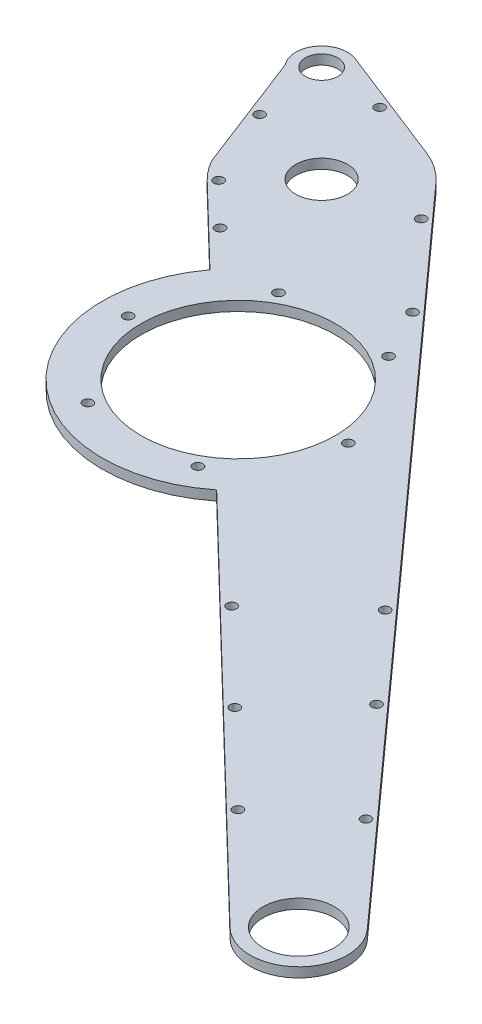
ISO-10303-21;
HEADER;
FILE_DESCRIPTION(('STEP AP214'),'2;1');
FILE_NAME('part.step','',(''),(''),'','','');
FILE_SCHEMA(('AUTOMOTIVE_DESIGN { 1 0 10303 214 1 1 1 1 }'));
ENDSEC;
DATA;
#1=APPLICATION_CONTEXT('core data for automotive mechanical design processes');
#2=APPLICATION_PROTOCOL_DEFINITION('international standard','automotive_design',2000,#1);
#3=PRODUCT_CONTEXT('',#1,'mechanical');
#4=PRODUCT('Part','Part','',(#3));
#5=PRODUCT_RELATED_PRODUCT_CATEGORY('part','',(#4));
#6=PRODUCT_DEFINITION_FORMATION('','',#4);
#7=PRODUCT_DEFINITION_CONTEXT('part definition',#1,'design');
#8=PRODUCT_DEFINITION('design','',#6,#7);
#9=PRODUCT_DEFINITION_SHAPE('','',#8);
#10=(LENGTH_UNIT() NAMED_UNIT(*) SI_UNIT(.MILLI.,.METRE.));
#11=(NAMED_UNIT(*) PLANE_ANGLE_UNIT() SI_UNIT($,.RADIAN.));
#12=(NAMED_UNIT(*) SI_UNIT($,.STERADIAN.) SOLID_ANGLE_UNIT());
#13=UNCERTAINTY_MEASURE_WITH_UNIT(LENGTH_MEASURE(1.E-05),#10,'distance_accuracy_value','');
#14=(GEOMETRIC_REPRESENTATION_CONTEXT(3) GLOBAL_UNCERTAINTY_ASSIGNED_CONTEXT((#13)) GLOBAL_UNIT_ASSIGNED_CONTEXT((#10,
#11,#12)) REPRESENTATION_CONTEXT('',''));
#15=CARTESIAN_POINT('',(0.,0.,0.));
#16=DIRECTION('',(0.,0.,1.));
#17=DIRECTION('',(1.,0.,0.));
#18=AXIS2_PLACEMENT_3D('',#15,#16,#17);
#19=CARTESIAN_POINT('',(40.6989429108541,3.,66.4645055499677));
#20=DIRECTION('',(0.,-1.,0.));
#21=DIRECTION('',(0.,0.,-1.));
#22=AXIS2_PLACEMENT_3D('',#19,#20,#21);
#23=CYLINDRICAL_SURFACE('',#22,42.);
#24=CARTESIAN_POINT('',(40.6989429108541,0.,66.4645055499677));
#25=DIRECTION('',(0.,1.,0.));
#26=DIRECTION('',(0.,0.,1.));
#27=AXIS2_PLACEMENT_3D('',#24,#25,#26);
#28=CIRCLE('',#27,42.);
#29=CARTESIAN_POINT('',(6.95401125447118,0.,41.4589144250603));
#30=VERTEX_POINT('',#29);
#31=CARTESIAN_POINT('',(66.8817826108157,0.,99.3044036199391));
#32=VERTEX_POINT('',#31);
#33=EDGE_CURVE('E260',#30,#32,#28,.T.);
#34=ORIENTED_EDGE('',*,*,#33,.T.);
#35=DIRECTION('',(0.,-1.,0.));
#36=VECTOR('',#35,1.);
#37=CARTESIAN_POINT('',(66.8817826108157,3.,99.3044036199391));
#38=LINE('',#37,#36);
#39=CARTESIAN_POINT('',(66.8817826108157,3.,99.3044036199391));
#40=VERTEX_POINT('',#39);
#41=EDGE_CURVE('E11',#40,#32,#38,.T.);
#42=ORIENTED_EDGE('',*,*,#41,.F.);
#43=CARTESIAN_POINT('',(40.6989429108541,3.,66.4645055499677));
#44=DIRECTION('',(0.,1.,0.));
#45=DIRECTION('',(0.,0.,1.));
#46=AXIS2_PLACEMENT_3D('',#43,#44,#45);
#47=CIRCLE('',#46,42.);
#48=CARTESIAN_POINT('',(6.95401125447118,3.,41.4589144250603));
#49=VERTEX_POINT('',#48);
#50=EDGE_CURVE('E162',#49,#40,#47,.T.);
#51=ORIENTED_EDGE('',*,*,#50,.F.);
#52=DIRECTION('',(0.,-1.,0.));
#53=VECTOR('',#52,1.);
#54=CARTESIAN_POINT('',(6.95401125447118,3.,41.4589144250603));
#55=LINE('',#54,#53);
#56=EDGE_CURVE('E319',#49,#30,#55,.T.);
#57=ORIENTED_EDGE('',*,*,#56,.T.);
#58=EDGE_LOOP('',(#34,#42,#51,#57));
#59=FACE_BOUND('',#58,.T.);
#60=ADVANCED_FACE('F37',(#59),#23,.T.);
#61=CARTESIAN_POINT('',(-17.3624071779741,3.,17.9874071779741));
#62=DIRECTION('',(0.694496287118964,0.,-0.719496287118964));
#63=DIRECTION('',(-0.719496287118964,0.,-0.694496287118964));
#64=AXIS2_PLACEMENT_3D('',#61,#62,#63);
#65=PLANE('',#64);
#66=DIRECTION('',(0.719496287118964,0.,0.694496287118963));
#67=VECTOR('',#66,1.);
#68=CARTESIAN_POINT('',(-17.3624071779741,0.,17.9874071779741));
#69=LINE('',#68,#67);
#70=CARTESIAN_POINT('',(186.110074257621,0.,214.389925742379));
#71=VERTEX_POINT('',#70);
#72=EDGE_CURVE('E264',#32,#71,#69,.T.);
#73=ORIENTED_EDGE('',*,*,#72,.T.);
#74=DIRECTION('',(0.,-1.,0.));
#75=VECTOR('',#74,1.);
#76=CARTESIAN_POINT('',(186.110074257621,3.,214.389925742379));
#77=LINE('',#76,#75);
#78=CARTESIAN_POINT('',(186.110074257621,3.,214.389925742379));
#79=VERTEX_POINT('',#78);
#80=EDGE_CURVE('E46',#79,#71,#77,.T.);
#81=ORIENTED_EDGE('',*,*,#80,.F.);
#82=DIRECTION('',(0.719496287118964,0.,0.694496287118963));
#83=VECTOR('',#82,1.);
#84=CARTESIAN_POINT('',(-17.3624071779741,3.,17.9874071779741));
#85=LINE('',#84,#83);
#86=EDGE_CURVE('E104',#40,#79,#85,.T.);
#87=ORIENTED_EDGE('',*,*,#86,.F.);
#88=ORIENTED_EDGE('',*,*,#41,.T.);
#89=EDGE_LOOP('',(#73,#81,#87,#88));
#90=FACE_BOUND('',#89,.T.);
#91=ADVANCED_FACE('F344',(#90),#65,.F.);
#92=CARTESIAN_POINT('',(196.527518564405,3.,203.597481435595));
#93=DIRECTION('',(0.,-1.,0.));
#94=DIRECTION('',(0.,0.,-1.));
#95=AXIS2_PLACEMENT_3D('',#92,#93,#94);
#96=CYLINDRICAL_SURFACE('',#95,15.);
#97=CARTESIAN_POINT('',(196.527518564405,0.,203.597481435595));
#98=DIRECTION('',(0.,1.,0.));
#99=DIRECTION('',(0.,0.,1.));
#100=AXIS2_PLACEMENT_3D('',#97,#98,#99);
#101=CIRCLE('',#100,15.);
#102=CARTESIAN_POINT('',(207.681250795877,0.,193.567812582206));
#103=VERTEX_POINT('',#102);
#104=EDGE_CURVE('E269',#71,#103,#101,.T.);
#105=ORIENTED_EDGE('',*,*,#104,.T.);
#106=DIRECTION('',(0.,-1.,0.));
#107=VECTOR('',#106,1.);
#108=CARTESIAN_POINT('',(207.681250795877,3.,193.567812582206));
#109=LINE('',#108,#107);
#110=CARTESIAN_POINT('',(207.681250795877,3.,193.567812582206));
#111=VERTEX_POINT('',#110);
#112=EDGE_CURVE('E329',#111,#103,#109,.T.);
#113=ORIENTED_EDGE('',*,*,#112,.F.);
#114=CARTESIAN_POINT('',(196.527518564405,3.,203.597481435595));
#115=DIRECTION('',(0.,1.,0.));
#116=DIRECTION('',(0.,0.,1.));
#117=AXIS2_PLACEMENT_3D('',#114,#115,#116);
#118=CIRCLE('',#117,15.);
#119=EDGE_CURVE('E157',#79,#111,#118,.T.);
#120=ORIENTED_EDGE('',*,*,#119,.F.);
#121=ORIENTED_EDGE('',*,*,#80,.T.);
#122=EDGE_LOOP('',(#105,#113,#120,#121));
#123=FACE_BOUND('',#122,.T.);
#124=ADVANCED_FACE('F334',(#123),#96,.T.);
#125=CARTESIAN_POINT('',(18.5895537191193,3.,-16.7161147556476));
#126=DIRECTION('',(0.743582148764772,0.,-0.668644590225902));
#127=DIRECTION('',(-0.668644590225902,0.,-0.743582148764772));
#128=AXIS2_PLACEMENT_3D('',#125,#126,#127);
#129=PLANE('',#128);
#130=DIRECTION('',(0.668644590225902,0.,0.743582148764772));
#131=VECTOR('',#130,1.);
#132=CARTESIAN_POINT('',(18.5895537191193,0.,-16.7161147556476));
#133=LINE('',#132,#131);
#134=CARTESIAN_POINT('',(18.5895537191193,0.,-16.7161147556476));
#135=VERTEX_POINT('',#134);
#136=EDGE_CURVE('E277',#135,#103,#133,.T.);
#137=ORIENTED_EDGE('',*,*,#136,.F.);
#138=DIRECTION('',(0.,-1.,0.));
#139=VECTOR('',#138,1.);
#140=CARTESIAN_POINT('',(18.5895537191193,3.,-16.7161147556476));
#141=LINE('',#140,#139);
#142=CARTESIAN_POINT('',(18.5895537191193,3.,-16.7161147556476));
#143=VERTEX_POINT('',#142);
#144=EDGE_CURVE('E327',#143,#135,#141,.T.);
#145=ORIENTED_EDGE('',*,*,#144,.F.);
#146=DIRECTION('',(0.668644590225902,0.,0.743582148764772));
#147=VECTOR('',#146,1.);
#148=CARTESIAN_POINT('',(18.5895537191193,3.,-16.7161147556476));
#149=LINE('',#148,#147);
#150=EDGE_CURVE('E151',#143,#111,#149,.T.);
#151=ORIENTED_EDGE('',*,*,#150,.T.);
#152=ORIENTED_EDGE('',*,*,#112,.T.);
#153=EDGE_LOOP('',(#137,#145,#151,#152));
#154=FACE_BOUND('',#153,.T.);
#155=ADVANCED_FACE('F340',(#154),#129,.T.);
#156=CARTESIAN_POINT('',(0.,3.,0.));
#157=DIRECTION('',(0.,-1.,0.));
#158=DIRECTION('',(0.,0.,-1.));
#159=AXIS2_PLACEMENT_3D('',#156,#157,#158);
#160=CYLINDRICAL_SURFACE('',#159,25.);
#161=CARTESIAN_POINT('',(0.,0.,0.));
#162=DIRECTION('',(0.,1.,0.));
#163=DIRECTION('',(0.,0.,1.));
#164=AXIS2_PLACEMENT_3D('',#161,#162,#163);
#165=CIRCLE('',#164,25.);
#166=CARTESIAN_POINT('',(9.113159771314,0.,-23.2798264379807));
#167=VERTEX_POINT('',#166);
#168=EDGE_CURVE('E280',#135,#167,#165,.T.);
#169=ORIENTED_EDGE('',*,*,#168,.T.);
#170=DIRECTION('',(0.,-1.,0.));
#171=VECTOR('',#170,1.);
#172=CARTESIAN_POINT('',(9.113159771314,3.,-23.2798264379807));
#173=LINE('',#172,#171);
#174=CARTESIAN_POINT('',(9.113159771314,3.,-23.2798264379807));
#175=VERTEX_POINT('',#174);
#176=EDGE_CURVE('E325',#175,#167,#173,.T.);
#177=ORIENTED_EDGE('',*,*,#176,.F.);
#178=CARTESIAN_POINT('',(0.,3.,0.));
#179=DIRECTION('',(0.,1.,0.));
#180=DIRECTION('',(0.,0.,1.));
#181=AXIS2_PLACEMENT_3D('',#178,#179,#180);
#182=CIRCLE('',#181,25.);
#183=EDGE_CURVE('E145',#143,#175,#182,.T.);
#184=ORIENTED_EDGE('',*,*,#183,.F.);
#185=ORIENTED_EDGE('',*,*,#144,.T.);
#186=EDGE_LOOP('',(#169,#177,#184,#185));
#187=FACE_BOUND('',#186,.T.);
#188=ADVANCED_FACE('F342',(#187),#160,.T.);
#189=CARTESIAN_POINT('',(9.11315977131401,3.,-23.2798264379807));
#190=DIRECTION('',(0.36452639085256,0.,-0.931193057519227));
#191=DIRECTION('',(-0.931193057519227,0.,-0.36452639085256));
#192=AXIS2_PLACEMENT_3D('',#189,#190,#191);
#193=PLANE('',#192);
#194=DIRECTION('',(0.931193057519227,0.,0.36452639085256));
#195=VECTOR('',#194,1.);
#196=CARTESIAN_POINT('',(9.11315977131401,0.,-23.2798264379807));
#197=LINE('',#196,#195);
#198=CARTESIAN_POINT('',(-27.0837888731795,0.,-37.4495444601538));
#199=VERTEX_POINT('',#198);
#200=EDGE_CURVE('E283',#199,#167,#197,.T.);
#201=ORIENTED_EDGE('',*,*,#200,.F.);
#202=DIRECTION('',(0.,-1.,0.));
#203=VECTOR('',#202,1.);
#204=CARTESIAN_POINT('',(-27.0837888731795,3.,-37.4495444601538));
#205=LINE('',#204,#203);
#206=CARTESIAN_POINT('',(-27.0837888731795,3.,-37.4495444601538));
#207=VERTEX_POINT('',#206);
#208=EDGE_CURVE('E323',#207,#199,#205,.T.);
#209=ORIENTED_EDGE('',*,*,#208,.F.);
#210=DIRECTION('',(0.931193057519227,0.,0.36452639085256));
#211=VECTOR('',#210,1.);
#212=CARTESIAN_POINT('',(9.11315977131401,3.,-23.2798264379807));
#213=LINE('',#212,#211);
#214=EDGE_CURVE('E150',#207,#175,#213,.T.);
#215=ORIENTED_EDGE('',*,*,#214,.T.);
#216=ORIENTED_EDGE('',*,*,#176,.T.);
#217=EDGE_LOOP('',(#201,#209,#215,#216));
#218=FACE_BOUND('',#217,.T.);
#219=ADVANCED_FACE('F354',(#218),#193,.T.);
#220=CARTESIAN_POINT('',(-30.,3.,-30.));
#221=DIRECTION('',(0.,-1.,0.));
#222=DIRECTION('',(0.,0.,-1.));
#223=AXIS2_PLACEMENT_3D('',#220,#221,#222);
#224=CYLINDRICAL_SURFACE('',#223,7.99999999999999);
#225=CARTESIAN_POINT('',(-30.,0.,-30.));
#226=DIRECTION('',(0.,1.,0.));
#227=DIRECTION('',(0.,0.,1.));
#228=AXIS2_PLACEMENT_3D('',#225,#226,#227);
#229=CIRCLE('',#228,7.99999999999999);
#230=CARTESIAN_POINT('',(-36.2449979983984,0.,-25.));
#231=VERTEX_POINT('',#230);
#232=EDGE_CURVE('E286',#199,#231,#229,.T.);
#233=ORIENTED_EDGE('',*,*,#232,.T.);
#234=DIRECTION('',(0.,-1.,0.));
#235=VECTOR('',#234,1.);
#236=CARTESIAN_POINT('',(-36.2449979983984,3.,-25.));
#237=LINE('',#236,#235);
#238=CARTESIAN_POINT('',(-36.2449979983984,3.,-25.));
#239=VERTEX_POINT('',#238);
#240=EDGE_CURVE('E140',#239,#231,#237,.T.);
#241=ORIENTED_EDGE('',*,*,#240,.F.);
#242=CARTESIAN_POINT('',(-30.,3.,-30.));
#243=DIRECTION('',(0.,1.,0.));
#244=DIRECTION('',(0.,0.,1.));
#245=AXIS2_PLACEMENT_3D('',#242,#243,#244);
#246=CIRCLE('',#245,7.99999999999999);
#247=EDGE_CURVE('E131',#207,#239,#246,.T.);
#248=ORIENTED_EDGE('',*,*,#247,.F.);
#249=ORIENTED_EDGE('',*,*,#208,.T.);
#250=EDGE_LOOP('',(#233,#241,#248,#249));
#251=FACE_BOUND('',#250,.T.);
#252=ADVANCED_FACE('F357',(#251),#224,.T.);
#253=CARTESIAN_POINT('',(-23.1346555993659,3.,8.93719329089938));
#254=DIRECTION('',(0.932814350448732,0.,-0.360357305457945));
#255=DIRECTION('',(-0.360357305457945,0.,-0.932814350448732));
#256=AXIS2_PLACEMENT_3D('',#253,#254,#255);
#257=PLANE('',#256);
#258=DIRECTION('',(0.360357305457945,0.,0.932814350448732));
#259=VECTOR('',#258,1.);
#260=CARTESIAN_POINT('',(-23.1346555993659,0.,8.93719329089938));
#261=LINE('',#260,#259);
#262=CARTESIAN_POINT('',(-22.,0.,11.8743420870379));
#263=VERTEX_POINT('',#262);
#264=EDGE_CURVE('E139',#231,#263,#261,.T.);
#265=ORIENTED_EDGE('',*,*,#264,.T.);
#266=DIRECTION('',(0.,-1.,0.));
#267=VECTOR('',#266,1.);
#268=CARTESIAN_POINT('',(-22.,3.,11.8743420870379));
#269=LINE('',#268,#267);
#270=CARTESIAN_POINT('',(-22.,3.,11.8743420870379));
#271=VERTEX_POINT('',#270);
#272=EDGE_CURVE('E136',#271,#263,#269,.T.);
#273=ORIENTED_EDGE('',*,*,#272,.F.);
#274=DIRECTION('',(0.360357305457945,0.,0.932814350448732));
#275=VECTOR('',#274,1.);
#276=CARTESIAN_POINT('',(-23.1346555993659,3.,8.93719329089938));
#277=LINE('',#276,#275);
#278=EDGE_CURVE('E123',#239,#271,#277,.T.);
#279=ORIENTED_EDGE('',*,*,#278,.F.);
#280=ORIENTED_EDGE('',*,*,#240,.T.);
#281=EDGE_LOOP('',(#265,#273,#279,#280));
#282=FACE_BOUND('',#281,.T.);
#283=ADVANCED_FACE('F137',(#282),#257,.F.);
#284=CARTESIAN_POINT('',(-17.3624071779741,0.,17.9874071779741));
#285=VERTEX_POINT('',#284);
#286=EDGE_CURVE('E90',#263,#285,#165,.T.);
#287=ORIENTED_EDGE('',*,*,#286,.T.);
#288=DIRECTION('',(0.,-1.,0.));
#289=VECTOR('',#288,1.);
#290=CARTESIAN_POINT('',(-17.3624071779741,3.,17.9874071779741));
#291=LINE('',#290,#289);
#292=CARTESIAN_POINT('',(-17.3624071779741,3.,17.9874071779741));
#293=VERTEX_POINT('',#292);
#294=EDGE_CURVE('E141',#293,#285,#291,.T.);
#295=ORIENTED_EDGE('',*,*,#294,.F.);
#296=EDGE_CURVE('E128',#271,#293,#182,.T.);
#297=ORIENTED_EDGE('',*,*,#296,.F.);
#298=ORIENTED_EDGE('',*,*,#272,.T.);
#299=EDGE_LOOP('',(#287,#295,#297,#298));
#300=FACE_BOUND('',#299,.T.);
#301=ADVANCED_FACE('F143',(#300),#160,.T.);
#302=CARTESIAN_POINT('',(-30.,3.,-30.));
#303=DIRECTION('',(0.,-1.,0.));
#304=DIRECTION('',(0.,0.,-1.));
#305=AXIS2_PLACEMENT_3D('',#302,#303,#304);
#306=CYLINDRICAL_SURFACE('',#305,5.);
#307=CARTESIAN_POINT('',(-30.,3.,-30.));
#308=DIRECTION('',(0.,1.,0.));
#309=DIRECTION('',(0.,0.,1.));
#310=AXIS2_PLACEMENT_3D('',#307,#308,#309);
#311=CIRCLE('',#310,5.);
#312=CARTESIAN_POINT('',(-30.,3.,-25.));
#313=VERTEX_POINT('',#312);
#314=EDGE_CURVE('E744',#313,#313,#311,.T.);
#315=ORIENTED_EDGE('',*,*,#314,.T.);
#316=EDGE_LOOP('',(#315));
#317=FACE_BOUND('',#316,.T.);
#318=CARTESIAN_POINT('',(-30.,0.,-30.));
#319=DIRECTION('',(0.,1.,0.));
#320=DIRECTION('',(0.,0.,1.));
#321=AXIS2_PLACEMENT_3D('',#318,#319,#320);
#322=CIRCLE('',#321,5.);
#323=CARTESIAN_POINT('',(-30.,0.,-25.));
#324=VERTEX_POINT('',#323);
#325=EDGE_CURVE('E314',#324,#324,#322,.T.);
#326=ORIENTED_EDGE('',*,*,#325,.F.);
#327=EDGE_LOOP('',(#326));
#328=FACE_BOUND('',#327,.T.);
#329=ADVANCED_FACE('F366',(#317,#328),#306,.F.);
#330=CARTESIAN_POINT('',(23.6989429108537,3.,95.9093692786384));
#331=DIRECTION('',(0.,-1.,0.));
#332=DIRECTION('',(0.,0.,-1.));
#333=AXIS2_PLACEMENT_3D('',#330,#331,#332);
#334=CYLINDRICAL_SURFACE('',#333,1.5);
#335=CARTESIAN_POINT('',(23.6989429108537,3.,95.9093692786384));
#336=DIRECTION('',(0.,1.,0.));
#337=DIRECTION('',(0.,0.,1.));
#338=AXIS2_PLACEMENT_3D('',#335,#336,#337);
#339=CIRCLE('',#338,1.5);
#340=CARTESIAN_POINT('',(23.6989429108537,3.,97.4093692786384));
#341=VERTEX_POINT('',#340);
#342=EDGE_CURVE('E746',#341,#341,#339,.T.);
#343=ORIENTED_EDGE('',*,*,#342,.T.);
#344=EDGE_LOOP('',(#343));
#345=FACE_BOUND('',#344,.T.);
#346=CARTESIAN_POINT('',(23.6989429108537,0.,95.9093692786384));
#347=DIRECTION('',(0.,1.,0.));
#348=DIRECTION('',(0.,0.,1.));
#349=AXIS2_PLACEMENT_3D('',#346,#347,#348);
#350=CIRCLE('',#349,1.5);
#351=CARTESIAN_POINT('',(23.6989429108537,0.,97.4093692786384));
#352=VERTEX_POINT('',#351);
#353=EDGE_CURVE('E311',#352,#352,#350,.T.);
#354=ORIENTED_EDGE('',*,*,#353,.F.);
#355=EDGE_LOOP('',(#354));
#356=FACE_BOUND('',#355,.T.);
#357=ADVANCED_FACE('F397',(#345,#356),#334,.F.);
#358=CARTESIAN_POINT('',(57.6989429108538,3.,95.9093692786387));
#359=DIRECTION('',(0.,-1.,0.));
#360=DIRECTION('',(0.,0.,-1.));
#361=AXIS2_PLACEMENT_3D('',#358,#359,#360);
#362=CYLINDRICAL_SURFACE('',#361,1.5);
#363=CARTESIAN_POINT('',(57.6989429108538,3.,95.9093692786387));
#364=DIRECTION('',(0.,1.,0.));
#365=DIRECTION('',(0.,0.,1.));
#366=AXIS2_PLACEMENT_3D('',#363,#364,#365);
#367=CIRCLE('',#366,1.5);
#368=CARTESIAN_POINT('',(57.6989429108538,3.,97.4093692786387));
#369=VERTEX_POINT('',#368);
#370=EDGE_CURVE('E749',#369,#369,#367,.T.);
#371=ORIENTED_EDGE('',*,*,#370,.T.);
#372=EDGE_LOOP('',(#371));
#373=FACE_BOUND('',#372,.T.);
#374=CARTESIAN_POINT('',(57.6989429108538,0.,95.9093692786387));
#375=DIRECTION('',(0.,1.,0.));
#376=DIRECTION('',(0.,0.,1.));
#377=AXIS2_PLACEMENT_3D('',#374,#375,#376);
#378=CIRCLE('',#377,1.5);
#379=CARTESIAN_POINT('',(57.6989429108538,0.,97.4093692786387));
#380=VERTEX_POINT('',#379);
#381=EDGE_CURVE('E308',#380,#380,#378,.T.);
#382=ORIENTED_EDGE('',*,*,#381,.F.);
#383=EDGE_LOOP('',(#382));
#384=FACE_BOUND('',#383,.T.);
#385=ADVANCED_FACE('F393',(#373,#384),#362,.F.);
#386=CARTESIAN_POINT('',(6.69894291085409,3.,66.4645055499677));
#387=DIRECTION('',(0.,-1.,0.));
#388=DIRECTION('',(0.,0.,-1.));
#389=AXIS2_PLACEMENT_3D('',#386,#387,#388);
#390=CYLINDRICAL_SURFACE('',#389,1.5);
#391=CARTESIAN_POINT('',(6.69894291085409,3.,66.4645055499677));
#392=DIRECTION('',(0.,1.,0.));
#393=DIRECTION('',(0.,0.,1.));
#394=AXIS2_PLACEMENT_3D('',#391,#392,#393);
#395=CIRCLE('',#394,1.5);
#396=CARTESIAN_POINT('',(6.69894291085409,3.,67.9645055499677));
#397=VERTEX_POINT('',#396);
#398=EDGE_CURVE('E754',#397,#397,#395,.T.);
#399=ORIENTED_EDGE('',*,*,#398,.T.);
#400=EDGE_LOOP('',(#399));
#401=FACE_BOUND('',#400,.T.);
#402=CARTESIAN_POINT('',(6.69894291085409,0.,66.4645055499677));
#403=DIRECTION('',(0.,1.,0.));
#404=DIRECTION('',(0.,0.,1.));
#405=AXIS2_PLACEMENT_3D('',#402,#403,#404);
#406=CIRCLE('',#405,1.5);
#407=CARTESIAN_POINT('',(6.69894291085409,0.,67.9645055499677));
#408=VERTEX_POINT('',#407);
#409=EDGE_CURVE('E305',#408,#408,#406,.T.);
#410=ORIENTED_EDGE('',*,*,#409,.F.);
#411=EDGE_LOOP('',(#410));
#412=FACE_BOUND('',#411,.T.);
#413=ADVANCED_FACE('F389',(#401,#412),#390,.F.);
#414=CARTESIAN_POINT('',(23.6989429108542,3.,37.0196418212967));
#415=DIRECTION('',(0.,-1.,0.));
#416=DIRECTION('',(0.,0.,-1.));
#417=AXIS2_PLACEMENT_3D('',#414,#415,#416);
#418=CYLINDRICAL_SURFACE('',#417,1.5);
#419=CARTESIAN_POINT('',(23.6989429108542,3.,37.0196418212967));
#420=DIRECTION('',(0.,1.,0.));
#421=DIRECTION('',(0.,0.,1.));
#422=AXIS2_PLACEMENT_3D('',#419,#420,#421);
#423=CIRCLE('',#422,1.5);
#424=CARTESIAN_POINT('',(23.6989429108542,3.,38.5196418212967));
#425=VERTEX_POINT('',#424);
#426=EDGE_CURVE('E757',#425,#425,#423,.T.);
#427=ORIENTED_EDGE('',*,*,#426,.T.);
#428=EDGE_LOOP('',(#427));
#429=FACE_BOUND('',#428,.T.);
#430=CARTESIAN_POINT('',(23.6989429108542,0.,37.0196418212967));
#431=DIRECTION('',(0.,1.,0.));
#432=DIRECTION('',(0.,0.,1.));
#433=AXIS2_PLACEMENT_3D('',#430,#431,#432);
#434=CIRCLE('',#433,1.5);
#435=CARTESIAN_POINT('',(23.6989429108542,0.,38.5196418212967));
#436=VERTEX_POINT('',#435);
#437=EDGE_CURVE('E302',#436,#436,#434,.T.);
#438=ORIENTED_EDGE('',*,*,#437,.F.);
#439=EDGE_LOOP('',(#438));
#440=FACE_BOUND('',#439,.T.);
#441=ADVANCED_FACE('F385',(#429,#440),#418,.F.);
#442=CARTESIAN_POINT('',(57.6989429108542,3.,37.0196418212968));
#443=DIRECTION('',(0.,-1.,0.));
#444=DIRECTION('',(0.,0.,-1.));
#445=AXIS2_PLACEMENT_3D('',#442,#443,#444);
#446=CYLINDRICAL_SURFACE('',#445,1.5);
#447=CARTESIAN_POINT('',(57.6989429108542,3.,37.0196418212968));
#448=DIRECTION('',(0.,1.,0.));
#449=DIRECTION('',(0.,0.,1.));
#450=AXIS2_PLACEMENT_3D('',#447,#448,#449);
#451=CIRCLE('',#450,1.5);
#452=CARTESIAN_POINT('',(57.6989429108542,3.,38.5196418212968));
#453=VERTEX_POINT('',#452);
#454=EDGE_CURVE('E760',#453,#453,#451,.T.);
#455=ORIENTED_EDGE('',*,*,#454,.T.);
#456=EDGE_LOOP('',(#455));
#457=FACE_BOUND('',#456,.T.);
#458=CARTESIAN_POINT('',(57.6989429108542,0.,37.0196418212968));
#459=DIRECTION('',(0.,1.,0.));
#460=DIRECTION('',(0.,0.,1.));
#461=AXIS2_PLACEMENT_3D('',#458,#459,#460);
#462=CIRCLE('',#461,1.5);
#463=CARTESIAN_POINT('',(57.6989429108542,0.,38.5196418212968));
#464=VERTEX_POINT('',#463);
#465=EDGE_CURVE('E299',#464,#464,#462,.T.);
#466=ORIENTED_EDGE('',*,*,#465,.F.);
#467=EDGE_LOOP('',(#466));
#468=FACE_BOUND('',#467,.T.);
#469=ADVANCED_FACE('F381',(#457,#468),#446,.F.);
#470=CARTESIAN_POINT('',(74.6989429108541,3.,66.4645055499679));
#471=DIRECTION('',(0.,-1.,0.));
#472=DIRECTION('',(0.,0.,-1.));
#473=AXIS2_PLACEMENT_3D('',#470,#471,#472);
#474=CYLINDRICAL_SURFACE('',#473,1.49999999999999);
#475=CARTESIAN_POINT('',(74.6989429108541,3.,66.4645055499679));
#476=DIRECTION('',(0.,1.,0.));
#477=DIRECTION('',(0.,0.,1.));
#478=AXIS2_PLACEMENT_3D('',#475,#476,#477);
#479=CIRCLE('',#478,1.49999999999999);
#480=CARTESIAN_POINT('',(74.6989429108541,3.,67.9645055499679));
#481=VERTEX_POINT('',#480);
#482=EDGE_CURVE('E763',#481,#481,#479,.T.);
#483=ORIENTED_EDGE('',*,*,#482,.T.);
#484=EDGE_LOOP('',(#483));
#485=FACE_BOUND('',#484,.T.);
#486=CARTESIAN_POINT('',(74.6989429108541,0.,66.4645055499679));
#487=DIRECTION('',(0.,1.,0.));
#488=DIRECTION('',(0.,0.,1.));
#489=AXIS2_PLACEMENT_3D('',#486,#487,#488);
#490=CIRCLE('',#489,1.49999999999999);
#491=CARTESIAN_POINT('',(74.6989429108541,0.,67.9645055499679));
#492=VERTEX_POINT('',#491);
#493=EDGE_CURVE('E296',#492,#492,#490,.T.);
#494=ORIENTED_EDGE('',*,*,#493,.F.);
#495=EDGE_LOOP('',(#494));
#496=FACE_BOUND('',#495,.T.);
#497=ADVANCED_FACE('F377',(#485,#496),#474,.F.);
#498=CARTESIAN_POINT('',(0.,3.,0.));
#499=DIRECTION('',(0.,-1.,0.));
#500=DIRECTION('',(0.,0.,-1.));
#501=AXIS2_PLACEMENT_3D('',#498,#499,#500);
#502=CYLINDRICAL_SURFACE('',#501,8.);
#503=CARTESIAN_POINT('',(0.,3.,0.));
#504=DIRECTION('',(0.,1.,0.));
#505=DIRECTION('',(0.,0.,1.));
#506=AXIS2_PLACEMENT_3D('',#503,#504,#505);
#507=CIRCLE('',#506,8.);
#508=CARTESIAN_POINT('',(0.,3.,8.));
#509=VERTEX_POINT('',#508);
#510=EDGE_CURVE('E766',#509,#509,#507,.T.);
#511=ORIENTED_EDGE('',*,*,#510,.T.);
#512=EDGE_LOOP('',(#511));
#513=FACE_BOUND('',#512,.T.);
#514=CARTESIAN_POINT('',(0.,0.,0.));
#515=DIRECTION('',(0.,1.,0.));
#516=DIRECTION('',(0.,0.,1.));
#517=AXIS2_PLACEMENT_3D('',#514,#515,#516);
#518=CIRCLE('',#517,8.);
#519=CARTESIAN_POINT('',(0.,0.,8.));
#520=VERTEX_POINT('',#519);
#521=EDGE_CURVE('E293',#520,#520,#518,.T.);
#522=ORIENTED_EDGE('',*,*,#521,.F.);
#523=EDGE_LOOP('',(#522));
#524=FACE_BOUND('',#523,.T.);
#525=ADVANCED_FACE('F373',(#513,#524),#502,.F.);
#526=CARTESIAN_POINT('',(40.6989429108541,3.,66.4645055499677));
#527=DIRECTION('',(0.,-1.,0.));
#528=DIRECTION('',(0.,0.,-1.));
#529=AXIS2_PLACEMENT_3D('',#526,#527,#528);
#530=CYLINDRICAL_SURFACE('',#529,30.);
#531=CARTESIAN_POINT('',(40.6989429108541,3.,66.4645055499677));
#532=DIRECTION('',(0.,1.,0.));
#533=DIRECTION('',(0.,0.,1.));
#534=AXIS2_PLACEMENT_3D('',#531,#532,#533);
#535=CIRCLE('',#534,30.);
#536=CARTESIAN_POINT('',(40.6989429108541,3.,96.4645055499677));
#537=VERTEX_POINT('',#536);
#538=EDGE_CURVE('E146',#537,#537,#535,.T.);
#539=ORIENTED_EDGE('',*,*,#538,.T.);
#540=EDGE_LOOP('',(#539));
#541=FACE_BOUND('',#540,.T.);
#542=CARTESIAN_POINT('',(40.6989429108541,0.,66.4645055499677));
#543=DIRECTION('',(0.,1.,0.));
#544=DIRECTION('',(0.,0.,1.));
#545=AXIS2_PLACEMENT_3D('',#542,#543,#544);
#546=CIRCLE('',#545,30.);
#547=CARTESIAN_POINT('',(40.6989429108541,0.,96.4645055499677));
#548=VERTEX_POINT('',#547);
#549=EDGE_CURVE('E290',#548,#548,#546,.T.);
#550=ORIENTED_EDGE('',*,*,#549,.F.);
#551=EDGE_LOOP('',(#550));
#552=FACE_BOUND('',#551,.T.);
#553=ADVANCED_FACE('F370',(#541,#552),#530,.F.);
#554=CARTESIAN_POINT('',(-17.3624071779741,3.,17.9874071779741));
#555=DIRECTION('',(0.694496287118964,0.,-0.719496287118964));
#556=DIRECTION('',(-0.719496287118964,0.,-0.694496287118964));
#557=AXIS2_PLACEMENT_3D('',#554,#555,#556);
#558=PLANE('',#557);
#559=DIRECTION('',(0.719496287118964,0.,0.694496287118963));
#560=VECTOR('',#559,1.);
#561=CARTESIAN_POINT('',(-17.3624071779741,0.,17.9874071779741));
#562=LINE('',#561,#560);
#563=EDGE_CURVE('E96',#285,#30,#562,.T.);
#564=ORIENTED_EDGE('',*,*,#563,.T.);
#565=ORIENTED_EDGE('',*,*,#56,.F.);
#566=DIRECTION('',(0.719496287118964,0.,0.694496287118963));
#567=VECTOR('',#566,1.);
#568=CARTESIAN_POINT('',(-17.3624071779741,3.,17.9874071779741));
#569=LINE('',#568,#567);
#570=EDGE_CURVE('E55',#293,#49,#569,.T.);
#571=ORIENTED_EDGE('',*,*,#570,.F.);
#572=ORIENTED_EDGE('',*,*,#294,.T.);
#573=EDGE_LOOP('',(#564,#565,#571,#572));
#574=FACE_BOUND('',#573,.T.);
#575=ADVANCED_FACE('F367',(#574),#558,.F.);
#576=CARTESIAN_POINT('',(196.527518564405,3.,203.597481435595));
#577=DIRECTION('',(0.,-1.,0.));
#578=DIRECTION('',(0.,0.,-1.));
#579=AXIS2_PLACEMENT_3D('',#576,#577,#578);
#580=CYLINDRICAL_SURFACE('',#579,11.);
#581=CARTESIAN_POINT('',(196.527518564405,3.,203.597481435595));
#582=DIRECTION('',(0.,1.,0.));
#583=DIRECTION('',(0.,0.,1.));
#584=AXIS2_PLACEMENT_3D('',#581,#582,#583);
#585=CIRCLE('',#584,11.);
#586=CARTESIAN_POINT('',(196.527518564405,3.,214.597481435595));
#587=VERTEX_POINT('',#586);
#588=EDGE_CURVE('E272',#587,#587,#585,.T.);
#589=ORIENTED_EDGE('',*,*,#588,.T.);
#590=EDGE_LOOP('',(#589));
#591=FACE_BOUND('',#590,.T.);
#592=CARTESIAN_POINT('',(196.527518564405,0.,203.597481435595));
#593=DIRECTION('',(0.,1.,0.));
#594=DIRECTION('',(0.,0.,1.));
#595=AXIS2_PLACEMENT_3D('',#592,#593,#594);
#596=CIRCLE('',#595,11.);
#597=CARTESIAN_POINT('',(196.527518564405,0.,214.597481435595));
#598=VERTEX_POINT('',#597);
#599=EDGE_CURVE('E164',#598,#598,#596,.T.);
#600=ORIENTED_EDGE('',*,*,#599,.F.);
#601=EDGE_LOOP('',(#600));
#602=FACE_BOUND('',#601,.T.);
#603=ADVANCED_FACE('F209',(#591,#602),#580,.F.);
#604=CARTESIAN_POINT('',(0.,3.,0.));
#605=DIRECTION('',(0.,1.,0.));
#606=DIRECTION('',(0.,0.,1.));
#607=AXIS2_PLACEMENT_3D('',#604,#605,#606);
#608=PLANE('',#607);
#609=CARTESIAN_POINT('',(155.700523111304,3.,181.562347911993));
#610=DIRECTION('',(0.,1.,0.));
#611=DIRECTION('',(0.,0.,1.));
#612=AXIS2_PLACEMENT_3D('',#609,#610,#611);
#613=CIRCLE('',#612,1.5);
#614=CARTESIAN_POINT('',(155.700523111304,3.,183.062347911993));
#615=VERTEX_POINT('',#614);
#616=EDGE_CURVE('E169',#615,#615,#613,.T.);
#617=ORIENTED_EDGE('',*,*,#616,.F.);
#618=EDGE_LOOP('',(#617));
#619=FACE_BOUND('',#618,.T.);
#620=CARTESIAN_POINT('',(148.934969969465,3.,131.976518296959));
#621=DIRECTION('',(0.,1.,0.));
#622=DIRECTION('',(0.,0.,1.));
#623=AXIS2_PLACEMENT_3D('',#620,#621,#622);
#624=CIRCLE('',#623,1.5);
#625=CARTESIAN_POINT('',(148.934969969465,3.,133.476518296959));
#626=VERTEX_POINT('',#625);
#627=EDGE_CURVE('E179',#626,#626,#624,.T.);
#628=ORIENTED_EDGE('',*,*,#627,.F.);
#629=EDGE_LOOP('',(#628));
#630=FACE_BOUND('',#629,.T.);
#631=CARTESIAN_POINT('',(177.993903369089,3.,164.29219758901));
#632=DIRECTION('',(0.,1.,0.));
#633=DIRECTION('',(0.,0.,1.));
#634=AXIS2_PLACEMENT_3D('',#631,#632,#633);
#635=CIRCLE('',#634,1.5);
#636=CARTESIAN_POINT('',(177.993903369089,3.,165.79219758901));
#637=VERTEX_POINT('',#636);
#638=EDGE_CURVE('E182',#637,#637,#635,.T.);
#639=ORIENTED_EDGE('',*,*,#638,.F.);
#640=EDGE_LOOP('',(#639));
#641=FACE_BOUND('',#640,.T.);
#642=CARTESIAN_POINT('',(125.057017775256,3.,105.422472604801));
#643=DIRECTION('',(0.,1.,0.));
#644=DIRECTION('',(0.,0.,1.));
#645=AXIS2_PLACEMENT_3D('',#642,#643,#644);
#646=CIRCLE('',#645,1.5);
#647=CARTESIAN_POINT('',(125.057017775256,3.,106.922472604801));
#648=VERTEX_POINT('',#647);
#649=EDGE_CURVE('E185',#648,#648,#646,.T.);
#650=ORIENTED_EDGE('',*,*,#649,.F.);
#651=EDGE_LOOP('',(#650));
#652=FACE_BOUND('',#651,.T.);
#653=CARTESIAN_POINT('',(100.268681967236,3.,128.056570951177));
#654=DIRECTION('',(0.,1.,0.));
#655=DIRECTION('',(0.,0.,1.));
#656=AXIS2_PLACEMENT_3D('',#653,#654,#655);
#657=CIRCLE('',#656,1.5);
#658=CARTESIAN_POINT('',(100.268681967236,3.,129.556570951177));
#659=VERTEX_POINT('',#658);
#660=EDGE_CURVE('E165',#659,#659,#657,.T.);
#661=ORIENTED_EDGE('',*,*,#660,.F.);
#662=EDGE_LOOP('',(#661));
#663=FACE_BOUND('',#662,.T.);
#664=CARTESIAN_POINT('',(127.883379130551,3.,154.711753185168));
#665=DIRECTION('',(0.,1.,0.));
#666=DIRECTION('',(0.,0.,1.));
#667=AXIS2_PLACEMENT_3D('',#664,#665,#666);
#668=CIRCLE('',#667,1.5);
#669=CARTESIAN_POINT('',(127.883379130551,3.,156.211753185168));
#670=VERTEX_POINT('',#669);
#671=EDGE_CURVE('E168',#670,#670,#668,.T.);
#672=ORIENTED_EDGE('',*,*,#671,.F.);
#673=EDGE_LOOP('',(#672));
#674=FACE_BOUND('',#673,.T.);
#675=CARTESIAN_POINT('',(-2.65653487277074,3.,28.7076483423792));
#676=DIRECTION('',(0.,1.,0.));
#677=DIRECTION('',(0.,0.,1.));
#678=AXIS2_PLACEMENT_3D('',#675,#676,#677);
#679=CIRCLE('',#678,1.5);
#680=CARTESIAN_POINT('',(-2.65653487277074,3.,30.2076483423792));
#681=VERTEX_POINT('',#680);
#682=EDGE_CURVE('E172',#681,#681,#679,.T.);
#683=ORIENTED_EDGE('',*,*,#682,.F.);
#684=EDGE_LOOP('',(#683));
#685=FACE_BOUND('',#684,.T.);
#686=CARTESIAN_POINT('',(-15.6261664601767,3.,16.1886664601767));
#687=DIRECTION('',(0.,1.,0.));
#688=DIRECTION('',(0.,0.,1.));
#689=AXIS2_PLACEMENT_3D('',#686,#687,#688);
#690=CIRCLE('',#689,1.5);
#691=CARTESIAN_POINT('',(-15.6261664601767,3.,17.6886664601767));
#692=VERTEX_POINT('',#691);
#693=EDGE_CURVE('E175',#692,#692,#690,.T.);
#694=ORIENTED_EDGE('',*,*,#693,.F.);
#695=EDGE_LOOP('',(#694));
#696=FACE_BOUND('',#695,.T.);
#697=CARTESIAN_POINT('',(49.6009841968948,3.,21.509792526872));
#698=DIRECTION('',(0.,1.,0.));
#699=DIRECTION('',(0.,0.,1.));
#700=AXIS2_PLACEMENT_3D('',#697,#698,#699);
#701=CIRCLE('',#700,1.5);
#702=CARTESIAN_POINT('',(49.6009841968948,3.,23.009792526872));
#703=VERTEX_POINT('',#702);
#704=EDGE_CURVE('E188',#703,#703,#701,.T.);
#705=ORIENTED_EDGE('',*,*,#704,.F.);
#706=EDGE_LOOP('',(#705));
#707=FACE_BOUND('',#706,.T.);
#708=CARTESIAN_POINT('',(25.9485594081661,3.,-4.79345004024134));
#709=DIRECTION('',(0.,1.,0.));
#710=DIRECTION('',(0.,0.,1.));
#711=AXIS2_PLACEMENT_3D('',#708,#709,#710);
#712=CIRCLE('',#711,1.5);
#713=CARTESIAN_POINT('',(25.9485594081661,3.,-3.29345004024134));
#714=VERTEX_POINT('',#713);
#715=EDGE_CURVE('E197',#714,#714,#712,.T.);
#716=ORIENTED_EDGE('',*,*,#715,.F.);
#717=EDGE_LOOP('',(#716));
#718=FACE_BOUND('',#717,.T.);
#719=CARTESIAN_POINT('',(-26.8959540444494,3.,-7.73679409575451));
#720=DIRECTION('',(0.,1.,0.));
#721=DIRECTION('',(0.,0.,1.));
#722=AXIS2_PLACEMENT_3D('',#719,#720,#721);
#723=CIRCLE('',#722,1.5);
#724=CARTESIAN_POINT('',(-26.8959540444494,3.,-6.23679409575451));
#725=VERTEX_POINT('',#724);
#726=EDGE_CURVE('E194',#725,#725,#723,.T.);
#727=ORIENTED_EDGE('',*,*,#726,.F.);
#728=EDGE_LOOP('',(#727));
#729=FACE_BOUND('',#728,.T.);
#730=CARTESIAN_POINT('',(-10.2721540340316,3.,-28.1837058646297));
#731=DIRECTION('',(0.,1.,0.));
#732=DIRECTION('',(0.,0.,1.));
#733=AXIS2_PLACEMENT_3D('',#730,#731,#732);
#734=CIRCLE('',#733,1.5);
#735=CARTESIAN_POINT('',(-10.2721540340316,3.,-26.6837058646297));
#736=VERTEX_POINT('',#735);
#737=EDGE_CURVE('E191',#736,#736,#734,.T.);
#738=ORIENTED_EDGE('',*,*,#737,.F.);
#739=EDGE_LOOP('',(#738));
#740=FACE_BOUND('',#739,.T.);
#741=ORIENTED_EDGE('',*,*,#50,.T.);
#742=ORIENTED_EDGE('',*,*,#86,.T.);
#743=ORIENTED_EDGE('',*,*,#119,.T.);
#744=ORIENTED_EDGE('',*,*,#150,.F.);
#745=ORIENTED_EDGE('',*,*,#183,.T.);
#746=ORIENTED_EDGE('',*,*,#214,.F.);
#747=ORIENTED_EDGE('',*,*,#247,.T.);
#748=ORIENTED_EDGE('',*,*,#278,.T.);
#749=ORIENTED_EDGE('',*,*,#296,.T.);
#750=ORIENTED_EDGE('',*,*,#570,.T.);
#751=EDGE_LOOP('',(#741,#742,#743,#744,#745,#746,#747,#748,#749,#750));
#752=FACE_BOUND('',#751,.T.);
#753=ORIENTED_EDGE('',*,*,#538,.F.);
#754=EDGE_LOOP('',(#753));
#755=FACE_BOUND('',#754,.T.);
#756=ORIENTED_EDGE('',*,*,#510,.F.);
#757=EDGE_LOOP('',(#756));
#758=FACE_BOUND('',#757,.T.);
#759=ORIENTED_EDGE('',*,*,#482,.F.);
#760=EDGE_LOOP('',(#759));
#761=FACE_BOUND('',#760,.T.);
#762=ORIENTED_EDGE('',*,*,#454,.F.);
#763=EDGE_LOOP('',(#762));
#764=FACE_BOUND('',#763,.T.);
#765=ORIENTED_EDGE('',*,*,#426,.F.);
#766=EDGE_LOOP('',(#765));
#767=FACE_BOUND('',#766,.T.);
#768=ORIENTED_EDGE('',*,*,#398,.F.);
#769=EDGE_LOOP('',(#768));
#770=FACE_BOUND('',#769,.T.);
#771=ORIENTED_EDGE('',*,*,#370,.F.);
#772=EDGE_LOOP('',(#771));
#773=FACE_BOUND('',#772,.T.);
#774=ORIENTED_EDGE('',*,*,#342,.F.);
#775=EDGE_LOOP('',(#774));
#776=FACE_BOUND('',#775,.T.);
#777=ORIENTED_EDGE('',*,*,#314,.F.);
#778=EDGE_LOOP('',(#777));
#779=FACE_BOUND('',#778,.T.);
#780=ORIENTED_EDGE('',*,*,#588,.F.);
#781=EDGE_LOOP('',(#780));
#782=FACE_BOUND('',#781,.T.);
#783=ADVANCED_FACE('F125',(#619,#630,#641,#652,#663,#674,#685,#696,#707,#718,#729,#740,#752,
#755,#758,#761,#764,#767,#770,#773,#776,#779,#782),#608,.T.);
#784=CARTESIAN_POINT('',(0.,0.,0.));
#785=DIRECTION('',(0.,1.,0.));
#786=DIRECTION('',(0.,0.,1.));
#787=AXIS2_PLACEMENT_3D('',#784,#785,#786);
#788=PLANE('',#787);
#789=CARTESIAN_POINT('',(155.700523111304,0.,181.562347911993));
#790=DIRECTION('',(0.,1.,0.));
#791=DIRECTION('',(0.,0.,1.));
#792=AXIS2_PLACEMENT_3D('',#789,#790,#791);
#793=CIRCLE('',#792,1.5);
#794=CARTESIAN_POINT('',(155.700523111304,0.,183.062347911993));
#795=VERTEX_POINT('',#794);
#796=EDGE_CURVE('E40',#795,#795,#793,.T.);
#797=ORIENTED_EDGE('',*,*,#796,.T.);
#798=EDGE_LOOP('',(#797));
#799=FACE_BOUND('',#798,.T.);
#800=CARTESIAN_POINT('',(148.934969969465,0.,131.976518296959));
#801=DIRECTION('',(0.,1.,0.));
#802=DIRECTION('',(0.,0.,1.));
#803=AXIS2_PLACEMENT_3D('',#800,#801,#802);
#804=CIRCLE('',#803,1.5);
#805=CARTESIAN_POINT('',(148.934969969465,0.,133.476518296959));
#806=VERTEX_POINT('',#805);
#807=EDGE_CURVE('E255',#806,#806,#804,.T.);
#808=ORIENTED_EDGE('',*,*,#807,.T.);
#809=EDGE_LOOP('',(#808));
#810=FACE_BOUND('',#809,.T.);
#811=CARTESIAN_POINT('',(177.993903369089,0.,164.29219758901));
#812=DIRECTION('',(0.,1.,0.));
#813=DIRECTION('',(0.,0.,1.));
#814=AXIS2_PLACEMENT_3D('',#811,#812,#813);
#815=CIRCLE('',#814,1.5);
#816=CARTESIAN_POINT('',(177.993903369089,0.,165.79219758901));
#817=VERTEX_POINT('',#816);
#818=EDGE_CURVE('E253',#817,#817,#815,.T.);
#819=ORIENTED_EDGE('',*,*,#818,.T.);
#820=EDGE_LOOP('',(#819));
#821=FACE_BOUND('',#820,.T.);
#822=CARTESIAN_POINT('',(125.057017775256,0.,105.422472604801));
#823=DIRECTION('',(0.,1.,0.));
#824=DIRECTION('',(0.,0.,1.));
#825=AXIS2_PLACEMENT_3D('',#822,#823,#824);
#826=CIRCLE('',#825,1.5);
#827=CARTESIAN_POINT('',(125.057017775256,0.,106.922472604801));
#828=VERTEX_POINT('',#827);
#829=EDGE_CURVE('E250',#828,#828,#826,.T.);
#830=ORIENTED_EDGE('',*,*,#829,.T.);
#831=EDGE_LOOP('',(#830));
#832=FACE_BOUND('',#831,.T.);
#833=CARTESIAN_POINT('',(100.268681967236,0.,128.056570951177));
#834=DIRECTION('',(0.,1.,0.));
#835=DIRECTION('',(0.,0.,1.));
#836=AXIS2_PLACEMENT_3D('',#833,#834,#835);
#837=CIRCLE('',#836,1.5);
#838=CARTESIAN_POINT('',(100.268681967236,0.,129.556570951177));
#839=VERTEX_POINT('',#838);
#840=EDGE_CURVE('E247',#839,#839,#837,.T.);
#841=ORIENTED_EDGE('',*,*,#840,.T.);
#842=EDGE_LOOP('',(#841));
#843=FACE_BOUND('',#842,.T.);
#844=CARTESIAN_POINT('',(127.883379130551,0.,154.711753185168));
#845=DIRECTION('',(0.,1.,0.));
#846=DIRECTION('',(0.,0.,1.));
#847=AXIS2_PLACEMENT_3D('',#844,#845,#846);
#848=CIRCLE('',#847,1.5);
#849=CARTESIAN_POINT('',(127.883379130551,0.,156.211753185168));
#850=VERTEX_POINT('',#849);
#851=EDGE_CURVE('E244',#850,#850,#848,.T.);
#852=ORIENTED_EDGE('',*,*,#851,.T.);
#853=EDGE_LOOP('',(#852));
#854=FACE_BOUND('',#853,.T.);
#855=CARTESIAN_POINT('',(-2.65653487277074,0.,28.7076483423792));
#856=DIRECTION('',(0.,1.,0.));
#857=DIRECTION('',(0.,0.,1.));
#858=AXIS2_PLACEMENT_3D('',#855,#856,#857);
#859=CIRCLE('',#858,1.5);
#860=CARTESIAN_POINT('',(-2.65653487277074,0.,30.2076483423792));
#861=VERTEX_POINT('',#860);
#862=EDGE_CURVE('E241',#861,#861,#859,.T.);
#863=ORIENTED_EDGE('',*,*,#862,.T.);
#864=EDGE_LOOP('',(#863));
#865=FACE_BOUND('',#864,.T.);
#866=CARTESIAN_POINT('',(-15.6261664601767,0.,16.1886664601767));
#867=DIRECTION('',(0.,1.,0.));
#868=DIRECTION('',(0.,0.,1.));
#869=AXIS2_PLACEMENT_3D('',#866,#867,#868);
#870=CIRCLE('',#869,1.5);
#871=CARTESIAN_POINT('',(-15.6261664601767,0.,17.6886664601767));
#872=VERTEX_POINT('',#871);
#873=EDGE_CURVE('E238',#872,#872,#870,.T.);
#874=ORIENTED_EDGE('',*,*,#873,.T.);
#875=EDGE_LOOP('',(#874));
#876=FACE_BOUND('',#875,.T.);
#877=CARTESIAN_POINT('',(49.6009841968948,0.,21.509792526872));
#878=DIRECTION('',(0.,1.,0.));
#879=DIRECTION('',(0.,0.,1.));
#880=AXIS2_PLACEMENT_3D('',#877,#878,#879);
#881=CIRCLE('',#880,1.5);
#882=CARTESIAN_POINT('',(49.6009841968948,0.,23.009792526872));
#883=VERTEX_POINT('',#882);
#884=EDGE_CURVE('E235',#883,#883,#881,.T.);
#885=ORIENTED_EDGE('',*,*,#884,.T.);
#886=EDGE_LOOP('',(#885));
#887=FACE_BOUND('',#886,.T.);
#888=CARTESIAN_POINT('',(25.9485594081661,0.,-4.79345004024134));
#889=DIRECTION('',(0.,1.,0.));
#890=DIRECTION('',(0.,0.,1.));
#891=AXIS2_PLACEMENT_3D('',#888,#889,#890);
#892=CIRCLE('',#891,1.5);
#893=CARTESIAN_POINT('',(25.9485594081661,0.,-3.29345004024134));
#894=VERTEX_POINT('',#893);
#895=EDGE_CURVE('E229',#894,#894,#892,.T.);
#896=ORIENTED_EDGE('',*,*,#895,.T.);
#897=EDGE_LOOP('',(#896));
#898=FACE_BOUND('',#897,.T.);
#899=CARTESIAN_POINT('',(-26.8959540444494,0.,-7.73679409575451));
#900=DIRECTION('',(0.,1.,0.));
#901=DIRECTION('',(0.,0.,1.));
#902=AXIS2_PLACEMENT_3D('',#899,#900,#901);
#903=CIRCLE('',#902,1.5);
#904=CARTESIAN_POINT('',(-26.8959540444494,0.,-6.23679409575451));
#905=VERTEX_POINT('',#904);
#906=EDGE_CURVE('E226',#905,#905,#903,.T.);
#907=ORIENTED_EDGE('',*,*,#906,.T.);
#908=EDGE_LOOP('',(#907));
#909=FACE_BOUND('',#908,.T.);
#910=CARTESIAN_POINT('',(-10.2721540340316,0.,-28.1837058646297));
#911=DIRECTION('',(0.,1.,0.));
#912=DIRECTION('',(0.,0.,1.));
#913=AXIS2_PLACEMENT_3D('',#910,#911,#912);
#914=CIRCLE('',#913,1.5);
#915=CARTESIAN_POINT('',(-10.2721540340316,0.,-26.6837058646297));
#916=VERTEX_POINT('',#915);
#917=EDGE_CURVE('E178',#916,#916,#914,.T.);
#918=ORIENTED_EDGE('',*,*,#917,.T.);
#919=EDGE_LOOP('',(#918));
#920=FACE_BOUND('',#919,.T.);
#921=ORIENTED_EDGE('',*,*,#33,.F.);
#922=ORIENTED_EDGE('',*,*,#563,.F.);
#923=ORIENTED_EDGE('',*,*,#286,.F.);
#924=ORIENTED_EDGE('',*,*,#264,.F.);
#925=ORIENTED_EDGE('',*,*,#232,.F.);
#926=ORIENTED_EDGE('',*,*,#200,.T.);
#927=ORIENTED_EDGE('',*,*,#168,.F.);
#928=ORIENTED_EDGE('',*,*,#136,.T.);
#929=ORIENTED_EDGE('',*,*,#104,.F.);
#930=ORIENTED_EDGE('',*,*,#72,.F.);
#931=EDGE_LOOP('',(#921,#922,#923,#924,#925,#926,#927,#928,#929,#930));
#932=FACE_BOUND('',#931,.T.);
#933=ORIENTED_EDGE('',*,*,#549,.T.);
#934=EDGE_LOOP('',(#933));
#935=FACE_BOUND('',#934,.T.);
#936=ORIENTED_EDGE('',*,*,#521,.T.);
#937=EDGE_LOOP('',(#936));
#938=FACE_BOUND('',#937,.T.);
#939=ORIENTED_EDGE('',*,*,#493,.T.);
#940=EDGE_LOOP('',(#939));
#941=FACE_BOUND('',#940,.T.);
#942=ORIENTED_EDGE('',*,*,#465,.T.);
#943=EDGE_LOOP('',(#942));
#944=FACE_BOUND('',#943,.T.);
#945=ORIENTED_EDGE('',*,*,#437,.T.);
#946=EDGE_LOOP('',(#945));
#947=FACE_BOUND('',#946,.T.);
#948=ORIENTED_EDGE('',*,*,#409,.T.);
#949=EDGE_LOOP('',(#948));
#950=FACE_BOUND('',#949,.T.);
#951=ORIENTED_EDGE('',*,*,#381,.T.);
#952=EDGE_LOOP('',(#951));
#953=FACE_BOUND('',#952,.T.);
#954=ORIENTED_EDGE('',*,*,#353,.T.);
#955=EDGE_LOOP('',(#954));
#956=FACE_BOUND('',#955,.T.);
#957=ORIENTED_EDGE('',*,*,#325,.T.);
#958=EDGE_LOOP('',(#957));
#959=FACE_BOUND('',#958,.T.);
#960=ORIENTED_EDGE('',*,*,#599,.T.);
#961=EDGE_LOOP('',(#960));
#962=FACE_BOUND('',#961,.T.);
#963=ADVANCED_FACE('F208',(#799,#810,#821,#832,#843,#854,#865,#876,#887,#898,#909,#920,#932,
#935,#938,#941,#944,#947,#950,#953,#956,#959,#962),#788,.F.);
#964=CARTESIAN_POINT('',(-10.2721540340316,-7.,-28.1837058646297));
#965=DIRECTION('',(0.,1.,0.));
#966=DIRECTION('',(0.,0.,1.));
#967=AXIS2_PLACEMENT_3D('',#964,#965,#966);
#968=CYLINDRICAL_SURFACE('',#967,1.5);
#969=ORIENTED_EDGE('',*,*,#737,.T.);
#970=EDGE_LOOP('',(#969));
#971=FACE_BOUND('',#970,.T.);
#972=ORIENTED_EDGE('',*,*,#917,.F.);
#973=EDGE_LOOP('',(#972));
#974=FACE_BOUND('',#973,.T.);
#975=ADVANCED_FACE('F218',(#971,#974),#968,.F.);
#976=CARTESIAN_POINT('',(-26.8959540444494,-7.,-7.73679409575451));
#977=DIRECTION('',(0.,1.,0.));
#978=DIRECTION('',(0.,0.,1.));
#979=AXIS2_PLACEMENT_3D('',#976,#977,#978);
#980=CYLINDRICAL_SURFACE('',#979,1.5);
#981=ORIENTED_EDGE('',*,*,#726,.T.);
#982=EDGE_LOOP('',(#981));
#983=FACE_BOUND('',#982,.T.);
#984=ORIENTED_EDGE('',*,*,#906,.F.);
#985=EDGE_LOOP('',(#984));
#986=FACE_BOUND('',#985,.T.);
#987=ADVANCED_FACE('F221',(#983,#986),#980,.F.);
#988=CARTESIAN_POINT('',(25.9485594081661,-7.,-4.79345004024134));
#989=DIRECTION('',(0.,1.,0.));
#990=DIRECTION('',(0.,0.,1.));
#991=AXIS2_PLACEMENT_3D('',#988,#989,#990);
#992=CYLINDRICAL_SURFACE('',#991,1.5);
#993=ORIENTED_EDGE('',*,*,#715,.T.);
#994=EDGE_LOOP('',(#993));
#995=FACE_BOUND('',#994,.T.);
#996=ORIENTED_EDGE('',*,*,#895,.F.);
#997=EDGE_LOOP('',(#996));
#998=FACE_BOUND('',#997,.T.);
#999=ADVANCED_FACE('F444',(#995,#998),#992,.F.);
#1000=CARTESIAN_POINT('',(49.6009841968948,-7.,21.509792526872));
#1001=DIRECTION('',(0.,1.,0.));
#1002=DIRECTION('',(0.,0.,1.));
#1003=AXIS2_PLACEMENT_3D('',#1000,#1001,#1002);
#1004=CYLINDRICAL_SURFACE('',#1003,1.5);
#1005=ORIENTED_EDGE('',*,*,#704,.T.);
#1006=EDGE_LOOP('',(#1005));
#1007=FACE_BOUND('',#1006,.T.);
#1008=ORIENTED_EDGE('',*,*,#884,.F.);
#1009=EDGE_LOOP('',(#1008));
#1010=FACE_BOUND('',#1009,.T.);
#1011=ADVANCED_FACE('F203',(#1007,#1010),#1004,.F.);
#1012=CARTESIAN_POINT('',(-15.6261664601767,-7.,16.1886664601767));
#1013=DIRECTION('',(0.,1.,0.));
#1014=DIRECTION('',(0.,0.,1.));
#1015=AXIS2_PLACEMENT_3D('',#1012,#1013,#1014);
#1016=CYLINDRICAL_SURFACE('',#1015,1.5);
#1017=ORIENTED_EDGE('',*,*,#693,.T.);
#1018=EDGE_LOOP('',(#1017));
#1019=FACE_BOUND('',#1018,.T.);
#1020=ORIENTED_EDGE('',*,*,#873,.F.);
#1021=EDGE_LOOP('',(#1020));
#1022=FACE_BOUND('',#1021,.T.);
#1023=ADVANCED_FACE('F422',(#1019,#1022),#1016,.F.);
#1024=CARTESIAN_POINT('',(-2.65653487277074,-7.,28.7076483423792));
#1025=DIRECTION('',(0.,1.,0.));
#1026=DIRECTION('',(0.,0.,1.));
#1027=AXIS2_PLACEMENT_3D('',#1024,#1025,#1026);
#1028=CYLINDRICAL_SURFACE('',#1027,1.5);
#1029=ORIENTED_EDGE('',*,*,#682,.T.);
#1030=EDGE_LOOP('',(#1029));
#1031=FACE_BOUND('',#1030,.T.);
#1032=ORIENTED_EDGE('',*,*,#862,.F.);
#1033=EDGE_LOOP('',(#1032));
#1034=FACE_BOUND('',#1033,.T.);
#1035=ADVANCED_FACE('F418',(#1031,#1034),#1028,.F.);
#1036=CARTESIAN_POINT('',(127.883379130551,-7.,154.711753185168));
#1037=DIRECTION('',(0.,1.,0.));
#1038=DIRECTION('',(0.,0.,1.));
#1039=AXIS2_PLACEMENT_3D('',#1036,#1037,#1038);
#1040=CYLINDRICAL_SURFACE('',#1039,1.5);
#1041=ORIENTED_EDGE('',*,*,#671,.T.);
#1042=EDGE_LOOP('',(#1041));
#1043=FACE_BOUND('',#1042,.T.);
#1044=ORIENTED_EDGE('',*,*,#851,.F.);
#1045=EDGE_LOOP('',(#1044));
#1046=FACE_BOUND('',#1045,.T.);
#1047=ADVANCED_FACE('F414',(#1043,#1046),#1040,.F.);
#1048=CARTESIAN_POINT('',(100.268681967236,-7.,128.056570951177));
#1049=DIRECTION('',(0.,1.,0.));
#1050=DIRECTION('',(0.,0.,1.));
#1051=AXIS2_PLACEMENT_3D('',#1048,#1049,#1050);
#1052=CYLINDRICAL_SURFACE('',#1051,1.5);
#1053=ORIENTED_EDGE('',*,*,#660,.T.);
#1054=EDGE_LOOP('',(#1053));
#1055=FACE_BOUND('',#1054,.T.);
#1056=ORIENTED_EDGE('',*,*,#840,.F.);
#1057=EDGE_LOOP('',(#1056));
#1058=FACE_BOUND('',#1057,.T.);
#1059=ADVANCED_FACE('F410',(#1055,#1058),#1052,.F.);
#1060=CARTESIAN_POINT('',(125.057017775256,-7.,105.422472604801));
#1061=DIRECTION('',(0.,1.,0.));
#1062=DIRECTION('',(0.,0.,1.));
#1063=AXIS2_PLACEMENT_3D('',#1060,#1061,#1062);
#1064=CYLINDRICAL_SURFACE('',#1063,1.5);
#1065=ORIENTED_EDGE('',*,*,#649,.T.);
#1066=EDGE_LOOP('',(#1065));
#1067=FACE_BOUND('',#1066,.T.);
#1068=ORIENTED_EDGE('',*,*,#829,.F.);
#1069=EDGE_LOOP('',(#1068));
#1070=FACE_BOUND('',#1069,.T.);
#1071=ADVANCED_FACE('F413',(#1067,#1070),#1064,.F.);
#1072=CARTESIAN_POINT('',(177.993903369089,-7.,164.29219758901));
#1073=DIRECTION('',(0.,1.,0.));
#1074=DIRECTION('',(0.,0.,1.));
#1075=AXIS2_PLACEMENT_3D('',#1072,#1073,#1074);
#1076=CYLINDRICAL_SURFACE('',#1075,1.5);
#1077=ORIENTED_EDGE('',*,*,#638,.T.);
#1078=EDGE_LOOP('',(#1077));
#1079=FACE_BOUND('',#1078,.T.);
#1080=ORIENTED_EDGE('',*,*,#818,.F.);
#1081=EDGE_LOOP('',(#1080));
#1082=FACE_BOUND('',#1081,.T.);
#1083=ADVANCED_FACE('F431',(#1079,#1082),#1076,.F.);
#1084=CARTESIAN_POINT('',(148.934969969465,-7.,131.976518296959));
#1085=DIRECTION('',(0.,1.,0.));
#1086=DIRECTION('',(0.,0.,1.));
#1087=AXIS2_PLACEMENT_3D('',#1084,#1085,#1086);
#1088=CYLINDRICAL_SURFACE('',#1087,1.5);
#1089=ORIENTED_EDGE('',*,*,#627,.T.);
#1090=EDGE_LOOP('',(#1089));
#1091=FACE_BOUND('',#1090,.T.);
#1092=ORIENTED_EDGE('',*,*,#807,.F.);
#1093=EDGE_LOOP('',(#1092));
#1094=FACE_BOUND('',#1093,.T.);
#1095=ADVANCED_FACE('F427',(#1091,#1094),#1088,.F.);
#1096=CARTESIAN_POINT('',(155.700523111304,-7.,181.562347911993));
#1097=DIRECTION('',(0.,1.,0.));
#1098=DIRECTION('',(0.,0.,1.));
#1099=AXIS2_PLACEMENT_3D('',#1096,#1097,#1098);
#1100=CYLINDRICAL_SURFACE('',#1099,1.5);
#1101=ORIENTED_EDGE('',*,*,#616,.T.);
#1102=EDGE_LOOP('',(#1101));
#1103=FACE_BOUND('',#1102,.T.);
#1104=ORIENTED_EDGE('',*,*,#796,.F.);
#1105=EDGE_LOOP('',(#1104));
#1106=FACE_BOUND('',#1105,.T.);
#1107=ADVANCED_FACE('F430',(#1103,#1106),#1100,.F.);
#1108=CLOSED_SHELL('',(#60,#91,#124,#155,#188,#219,#252,#283,#301,#329,#357,#385,#413,#441,#469,
#497,#525,#553,#575,#603,#783,#963,#975,#987,#999,#1011,#1023,#1035,#1047,#1059,#1071,#1083,
#1095,#1107));
#1109=MANIFOLD_SOLID_BREP('B2',#1108);
#1110=ADVANCED_BREP_SHAPE_REPRESENTATION('',(#18,#1109),#14);
#1111=SHAPE_DEFINITION_REPRESENTATION(#9,#1110);
ENDSEC;
END-ISO-10303-21;
